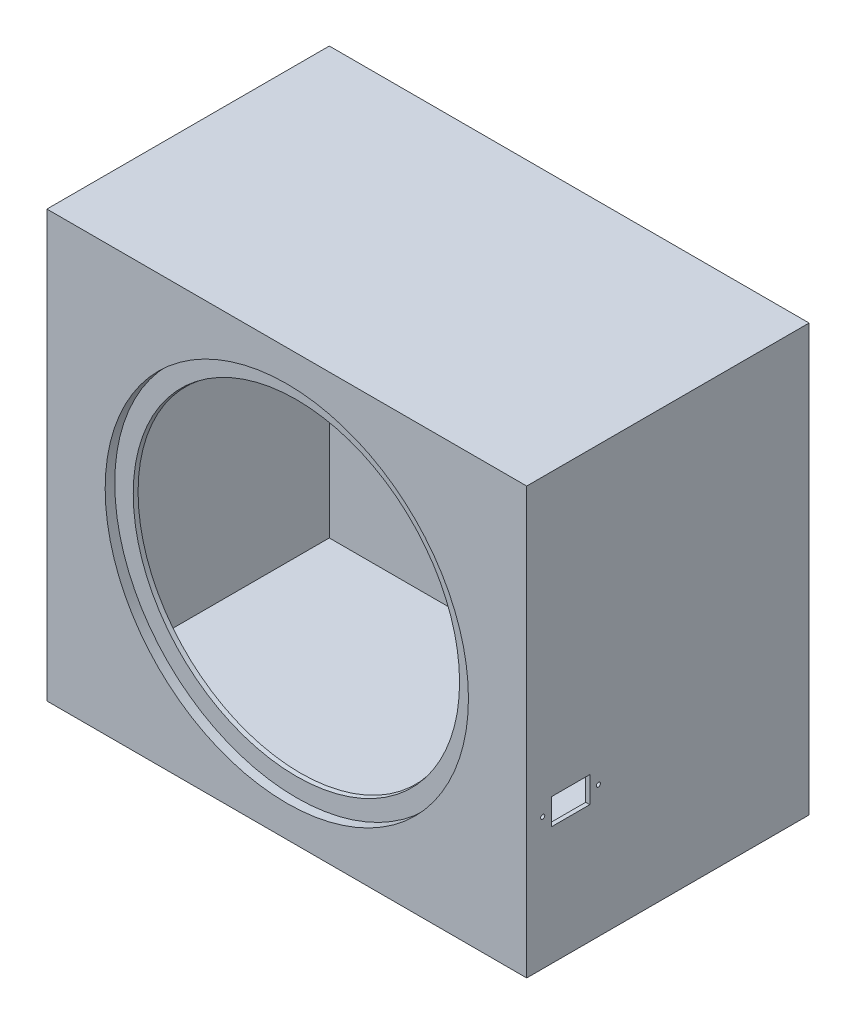
ISO-10303-21;
HEADER;
FILE_DESCRIPTION(('STEP AP214'),'2;1');
FILE_NAME('part.step','',(''),(''),'','','');
FILE_SCHEMA(('AUTOMOTIVE_DESIGN { 1 0 10303 214 1 1 1 1 }'));
ENDSEC;
DATA;
#1=APPLICATION_CONTEXT('core data for automotive mechanical design processes');
#2=APPLICATION_PROTOCOL_DEFINITION('international standard','automotive_design',2000,#1);
#3=PRODUCT_CONTEXT('',#1,'mechanical');
#4=PRODUCT('Part','Part','',(#3));
#5=PRODUCT_RELATED_PRODUCT_CATEGORY('part','',(#4));
#6=PRODUCT_DEFINITION_FORMATION('','',#4);
#7=PRODUCT_DEFINITION_CONTEXT('part definition',#1,'design');
#8=PRODUCT_DEFINITION('design','',#6,#7);
#9=PRODUCT_DEFINITION_SHAPE('','',#8);
#10=(LENGTH_UNIT() NAMED_UNIT(*) SI_UNIT(.MILLI.,.METRE.));
#11=(NAMED_UNIT(*) PLANE_ANGLE_UNIT() SI_UNIT($,.RADIAN.));
#12=(NAMED_UNIT(*) SI_UNIT($,.STERADIAN.) SOLID_ANGLE_UNIT());
#13=UNCERTAINTY_MEASURE_WITH_UNIT(LENGTH_MEASURE(1.E-05),#10,'distance_accuracy_value','');
#14=(GEOMETRIC_REPRESENTATION_CONTEXT(3) GLOBAL_UNCERTAINTY_ASSIGNED_CONTEXT((#13)) GLOBAL_UNIT_ASSIGNED_CONTEXT((#10,
#11,#12)) REPRESENTATION_CONTEXT('',''));
#15=CARTESIAN_POINT('',(0.,0.,0.));
#16=DIRECTION('',(0.,0.,1.));
#17=DIRECTION('',(1.,0.,0.));
#18=AXIS2_PLACEMENT_3D('',#15,#16,#17);
#19=CARTESIAN_POINT('',(0.,0.,-7.00000000000001));
#20=DIRECTION('',(0.,0.,1.));
#21=DIRECTION('',(1.,0.,0.));
#22=AXIS2_PLACEMENT_3D('',#19,#20,#21);
#23=CONICAL_SURFACE('',#22,118.5,0.17453292519943);
#24=CARTESIAN_POINT('',(0.,0.,-4.00000000000001));
#25=DIRECTION('',(0.,0.,-1.));
#26=DIRECTION('',(-1.,0.,0.));
#27=AXIS2_PLACEMENT_3D('',#24,#25,#26);
#28=CIRCLE('',#27,119.028980942125);
#29=CARTESIAN_POINT('',(-119.028980942125,0.,-4.00000000000001));
#30=VERTEX_POINT('',#29);
#31=EDGE_CURVE('E38',#30,#30,#28,.F.);
#32=ORIENTED_EDGE('',*,*,#31,.T.);
#33=EDGE_LOOP('',(#32));
#34=FACE_BOUND('',#33,.T.);
#35=CARTESIAN_POINT('',(0.,0.,-7.00000000000001));
#36=DIRECTION('',(0.,0.,1.));
#37=DIRECTION('',(1.,0.,0.));
#38=AXIS2_PLACEMENT_3D('',#35,#36,#37);
#39=CIRCLE('',#38,118.5);
#40=CARTESIAN_POINT('',(118.5,0.,-7.00000000000001));
#41=VERTEX_POINT('',#40);
#42=EDGE_CURVE('E176',#41,#41,#39,.T.);
#43=ORIENTED_EDGE('',*,*,#42,.F.);
#44=EDGE_LOOP('',(#43));
#45=FACE_BOUND('',#44,.T.);
#46=ADVANCED_FACE('F34',(#34,#45),#23,.F.);
#47=CARTESIAN_POINT('',(-175.,152.4,-200.));
#48=DIRECTION('',(-1.,0.,0.));
#49=DIRECTION('',(0.,0.,1.));
#50=AXIS2_PLACEMENT_3D('',#47,#48,#49);
#51=PLANE('',#50);
#52=CARTESIAN_POINT('',(-175.,-140.4,-40.65));
#53=DIRECTION('',(-1.,0.,0.));
#54=DIRECTION('',(0.,0.,1.));
#55=AXIS2_PLACEMENT_3D('',#52,#53,#54);
#56=CIRCLE('',#55,2.65000000000002);
#57=CARTESIAN_POINT('',(-175.,-140.4,-38.));
#58=VERTEX_POINT('',#57);
#59=EDGE_CURVE('E152',#58,#58,#56,.T.);
#60=ORIENTED_EDGE('',*,*,#59,.F.);
#61=EDGE_LOOP('',(#60));
#62=FACE_BOUND('',#61,.T.);
#63=CARTESIAN_POINT('',(-175.,-140.4,-22.));
#64=DIRECTION('',(-1.,0.,0.));
#65=DIRECTION('',(0.,0.,1.));
#66=AXIS2_PLACEMENT_3D('',#63,#64,#65);
#67=CIRCLE('',#66,2.65000000000002);
#68=CARTESIAN_POINT('',(-175.,-140.4,-19.35));
#69=VERTEX_POINT('',#68);
#70=EDGE_CURVE('E161',#69,#69,#67,.T.);
#71=ORIENTED_EDGE('',*,*,#70,.F.);
#72=EDGE_LOOP('',(#71));
#73=FACE_BOUND('',#72,.T.);
#74=CARTESIAN_POINT('',(-175.,-121.75,-22.));
#75=DIRECTION('',(-1.,0.,0.));
#76=DIRECTION('',(0.,0.,1.));
#77=AXIS2_PLACEMENT_3D('',#74,#75,#76);
#78=CIRCLE('',#77,2.65000000000001);
#79=CARTESIAN_POINT('',(-175.,-121.75,-19.35));
#80=VERTEX_POINT('',#79);
#81=EDGE_CURVE('E153',#80,#80,#78,.T.);
#82=ORIENTED_EDGE('',*,*,#81,.F.);
#83=EDGE_LOOP('',(#82));
#84=FACE_BOUND('',#83,.T.);
#85=CARTESIAN_POINT('',(-175.,-121.75,-40.65));
#86=DIRECTION('',(-1.,0.,0.));
#87=DIRECTION('',(0.,0.,1.));
#88=AXIS2_PLACEMENT_3D('',#85,#86,#87);
#89=CIRCLE('',#88,2.65000000000001);
#90=CARTESIAN_POINT('',(-175.,-121.75,-38.));
#91=VERTEX_POINT('',#90);
#92=EDGE_CURVE('E160',#91,#91,#89,.T.);
#93=ORIENTED_EDGE('',*,*,#92,.F.);
#94=EDGE_LOOP('',(#93));
#95=FACE_BOUND('',#94,.T.);
#96=DIRECTION('',(0.,0.,-1.));
#97=VECTOR('',#96,1.);
#98=CARTESIAN_POINT('',(-175.,-155.4,-200.));
#99=LINE('',#98,#97);
#100=CARTESIAN_POINT('',(-175.,-155.4,3.));
#101=VERTEX_POINT('',#100);
#102=CARTESIAN_POINT('',(-175.,-155.4,-203.));
#103=VERTEX_POINT('',#102);
#104=EDGE_CURVE('E217',#101,#103,#99,.T.);
#105=ORIENTED_EDGE('',*,*,#104,.F.);
#106=DIRECTION('',(0.,-1.,0.));
#107=VECTOR('',#106,1.);
#108=CARTESIAN_POINT('',(-175.,152.4,3.));
#109=LINE('',#108,#107);
#110=CARTESIAN_POINT('',(-175.,155.4,3.));
#111=VERTEX_POINT('',#110);
#112=EDGE_CURVE('E222',#111,#101,#109,.T.);
#113=ORIENTED_EDGE('',*,*,#112,.F.);
#114=DIRECTION('',(0.,0.,-1.));
#115=VECTOR('',#114,1.);
#116=CARTESIAN_POINT('',(-175.,155.4,-200.));
#117=LINE('',#116,#115);
#118=CARTESIAN_POINT('',(-175.,155.4,-203.));
#119=VERTEX_POINT('',#118);
#120=EDGE_CURVE('E227',#111,#119,#117,.T.);
#121=ORIENTED_EDGE('',*,*,#120,.T.);
#122=DIRECTION('',(0.,-1.,0.));
#123=VECTOR('',#122,1.);
#124=CARTESIAN_POINT('',(-175.,152.4,-203.));
#125=LINE('',#124,#123);
#126=EDGE_CURVE('E225',#119,#103,#125,.T.);
#127=ORIENTED_EDGE('',*,*,#126,.T.);
#128=EDGE_LOOP('',(#105,#113,#121,#127));
#129=FACE_BOUND('',#128,.T.);
#130=ADVANCED_FACE('F270',(#62,#73,#84,#95,#129),#51,.T.);
#131=CARTESIAN_POINT('',(150.,155.4,-200.));
#132=DIRECTION('',(0.,1.,0.));
#133=DIRECTION('',(0.,0.,1.));
#134=AXIS2_PLACEMENT_3D('',#131,#132,#133);
#135=PLANE('',#134);
#136=DIRECTION('',(-1.,0.,0.));
#137=VECTOR('',#136,1.);
#138=CARTESIAN_POINT('',(150.,155.4,3.));
#139=LINE('',#138,#137);
#140=CARTESIAN_POINT('',(175.,155.4,3.));
#141=VERTEX_POINT('',#140);
#142=EDGE_CURVE('E234',#141,#111,#139,.T.);
#143=ORIENTED_EDGE('',*,*,#142,.F.);
#144=DIRECTION('',(0.,0.,1.));
#145=VECTOR('',#144,1.);
#146=CARTESIAN_POINT('',(175.,155.4,0.));
#147=LINE('',#146,#145);
#148=CARTESIAN_POINT('',(175.,155.4,-203.));
#149=VERTEX_POINT('',#148);
#150=EDGE_CURVE('E220',#149,#141,#147,.T.);
#151=ORIENTED_EDGE('',*,*,#150,.F.);
#152=DIRECTION('',(-1.,0.,0.));
#153=VECTOR('',#152,1.);
#154=CARTESIAN_POINT('',(150.,155.4,-203.));
#155=LINE('',#154,#153);
#156=EDGE_CURVE('E11',#149,#119,#155,.T.);
#157=ORIENTED_EDGE('',*,*,#156,.T.);
#158=ORIENTED_EDGE('',*,*,#120,.F.);
#159=EDGE_LOOP('',(#143,#151,#157,#158));
#160=FACE_BOUND('',#159,.T.);
#161=ADVANCED_FACE('F275',(#160),#135,.T.);
#162=CARTESIAN_POINT('',(150.,-155.4,-200.));
#163=DIRECTION('',(0.,-1.,0.));
#164=DIRECTION('',(0.,0.,-1.));
#165=AXIS2_PLACEMENT_3D('',#162,#163,#164);
#166=PLANE('',#165);
#167=DIRECTION('',(1.,0.,0.));
#168=VECTOR('',#167,1.);
#169=CARTESIAN_POINT('',(150.,-155.4,3.));
#170=LINE('',#169,#168);
#171=CARTESIAN_POINT('',(175.,-155.4,3.));
#172=VERTEX_POINT('',#171);
#173=EDGE_CURVE('E233',#101,#172,#170,.T.);
#174=ORIENTED_EDGE('',*,*,#173,.F.);
#175=ORIENTED_EDGE('',*,*,#104,.T.);
#176=DIRECTION('',(1.,0.,0.));
#177=VECTOR('',#176,1.);
#178=CARTESIAN_POINT('',(150.,-155.4,-203.));
#179=LINE('',#178,#177);
#180=CARTESIAN_POINT('',(175.,-155.4,-203.));
#181=VERTEX_POINT('',#180);
#182=EDGE_CURVE('E43',#103,#181,#179,.T.);
#183=ORIENTED_EDGE('',*,*,#182,.T.);
#184=DIRECTION('',(0.,0.,1.));
#185=VECTOR('',#184,1.);
#186=CARTESIAN_POINT('',(175.,-155.4,-200.));
#187=LINE('',#186,#185);
#188=EDGE_CURVE('E221',#181,#172,#187,.T.);
#189=ORIENTED_EDGE('',*,*,#188,.T.);
#190=EDGE_LOOP('',(#174,#175,#183,#189));
#191=FACE_BOUND('',#190,.T.);
#192=ADVANCED_FACE('F284',(#191),#166,.T.);
#193=CARTESIAN_POINT('',(0.,0.,-203.));
#194=DIRECTION('',(0.,0.,-1.));
#195=DIRECTION('',(-1.,0.,0.));
#196=AXIS2_PLACEMENT_3D('',#193,#194,#195);
#197=PLANE('',#196);
#198=ORIENTED_EDGE('',*,*,#182,.F.);
#199=ORIENTED_EDGE('',*,*,#126,.F.);
#200=ORIENTED_EDGE('',*,*,#156,.F.);
#201=DIRECTION('',(0.,-1.,0.));
#202=VECTOR('',#201,1.);
#203=CARTESIAN_POINT('',(175.,0.,-203.));
#204=LINE('',#203,#202);
#205=EDGE_CURVE('E230',#149,#181,#204,.T.);
#206=ORIENTED_EDGE('',*,*,#205,.T.);
#207=EDGE_LOOP('',(#198,#199,#200,#206));
#208=FACE_BOUND('',#207,.T.);
#209=ADVANCED_FACE('F288',(#208),#197,.T.);
#210=CARTESIAN_POINT('',(0.,0.,3.));
#211=DIRECTION('',(0.,0.,-1.));
#212=DIRECTION('',(-1.,0.,0.));
#213=AXIS2_PLACEMENT_3D('',#210,#211,#212);
#214=PLANE('',#213);
#215=CARTESIAN_POINT('',(0.,0.,3.));
#216=DIRECTION('',(0.,0.,-1.));
#217=DIRECTION('',(-1.,0.,0.));
#218=AXIS2_PLACEMENT_3D('',#215,#216,#217);
#219=CIRCLE('',#218,132.5);
#220=CARTESIAN_POINT('',(-132.5,0.,3.));
#221=VERTEX_POINT('',#220);
#222=EDGE_CURVE('E244',#221,#221,#219,.F.);
#223=ORIENTED_EDGE('',*,*,#222,.F.);
#224=EDGE_LOOP('',(#223));
#225=FACE_BOUND('',#224,.T.);
#226=ORIENTED_EDGE('',*,*,#142,.T.);
#227=ORIENTED_EDGE('',*,*,#112,.T.);
#228=ORIENTED_EDGE('',*,*,#173,.T.);
#229=DIRECTION('',(0.,-1.,0.));
#230=VECTOR('',#229,1.);
#231=CARTESIAN_POINT('',(175.,0.,3.));
#232=LINE('',#231,#230);
#233=EDGE_CURVE('E226',#141,#172,#232,.T.);
#234=ORIENTED_EDGE('',*,*,#233,.F.);
#235=EDGE_LOOP('',(#226,#227,#228,#234));
#236=FACE_BOUND('',#235,.T.);
#237=ADVANCED_FACE('F292',(#225,#236),#214,.F.);
#238=CARTESIAN_POINT('',(175.,152.4,0.));
#239=DIRECTION('',(1.,0.,0.));
#240=DIRECTION('',(0.,0.,-1.));
#241=AXIS2_PLACEMENT_3D('',#238,#239,#240);
#242=PLANE('',#241);
#243=CARTESIAN_POINT('',(175.,-59.4,-49.32));
#244=DIRECTION('',(1.,0.,0.));
#245=DIRECTION('',(0.,0.,-1.));
#246=AXIS2_PLACEMENT_3D('',#243,#244,#245);
#247=CIRCLE('',#246,1.5);
#248=CARTESIAN_POINT('',(175.,-59.4,-50.82));
#249=VERTEX_POINT('',#248);
#250=EDGE_CURVE('E306',#249,#249,#247,.T.);
#251=ORIENTED_EDGE('',*,*,#250,.F.);
#252=EDGE_LOOP('',(#251));
#253=FACE_BOUND('',#252,.T.);
#254=CARTESIAN_POINT('',(175.,-59.4,-8.68));
#255=DIRECTION('',(1.,0.,0.));
#256=DIRECTION('',(0.,0.,-1.));
#257=AXIS2_PLACEMENT_3D('',#254,#255,#256);
#258=CIRCLE('',#257,1.5);
#259=CARTESIAN_POINT('',(175.,-59.4,-10.18));
#260=VERTEX_POINT('',#259);
#261=EDGE_CURVE('E310',#260,#260,#258,.T.);
#262=ORIENTED_EDGE('',*,*,#261,.F.);
#263=EDGE_LOOP('',(#262));
#264=FACE_BOUND('',#263,.T.);
#265=DIRECTION('',(0.,0.,-1.));
#266=VECTOR('',#265,1.);
#267=CARTESIAN_POINT('',(175.,-68.9,-15.));
#268=LINE('',#267,#266);
#269=CARTESIAN_POINT('',(175.,-68.9,-15.));
#270=VERTEX_POINT('',#269);
#271=CARTESIAN_POINT('',(175.,-68.9,-43.));
#272=VERTEX_POINT('',#271);
#273=EDGE_CURVE('E315',#270,#272,#268,.T.);
#274=ORIENTED_EDGE('',*,*,#273,.F.);
#275=DIRECTION('',(0.,-1.,0.));
#276=VECTOR('',#275,1.);
#277=CARTESIAN_POINT('',(175.,-49.9,-15.));
#278=LINE('',#277,#276);
#279=CARTESIAN_POINT('',(175.,-49.9,-15.));
#280=VERTEX_POINT('',#279);
#281=EDGE_CURVE('E144',#280,#270,#278,.T.);
#282=ORIENTED_EDGE('',*,*,#281,.F.);
#283=DIRECTION('',(0.,0.,1.));
#284=VECTOR('',#283,1.);
#285=CARTESIAN_POINT('',(175.,-49.9,-15.));
#286=LINE('',#285,#284);
#287=CARTESIAN_POINT('',(175.,-49.9,-43.));
#288=VERTEX_POINT('',#287);
#289=EDGE_CURVE('E51',#288,#280,#286,.T.);
#290=ORIENTED_EDGE('',*,*,#289,.F.);
#291=DIRECTION('',(0.,1.,0.));
#292=VECTOR('',#291,1.);
#293=CARTESIAN_POINT('',(175.,-49.9,-43.));
#294=LINE('',#293,#292);
#295=EDGE_CURVE('E327',#272,#288,#294,.T.);
#296=ORIENTED_EDGE('',*,*,#295,.F.);
#297=EDGE_LOOP('',(#274,#282,#290,#296));
#298=FACE_BOUND('',#297,.T.);
#299=ORIENTED_EDGE('',*,*,#188,.F.);
#300=ORIENTED_EDGE('',*,*,#205,.F.);
#301=ORIENTED_EDGE('',*,*,#150,.T.);
#302=ORIENTED_EDGE('',*,*,#233,.T.);
#303=EDGE_LOOP('',(#299,#300,#301,#302));
#304=FACE_BOUND('',#303,.T.);
#305=ADVANCED_FACE('F267',(#253,#264,#298,#304),#242,.T.);
#306=CARTESIAN_POINT('',(0.,0.,0.));
#307=DIRECTION('',(0.,0.,1.));
#308=DIRECTION('',(1.,0.,0.));
#309=AXIS2_PLACEMENT_3D('',#306,#307,#308);
#310=CYLINDRICAL_SURFACE('',#309,132.5);
#311=CARTESIAN_POINT('',(0.,0.,-4.00000000000001));
#312=DIRECTION('',(0.,0.,-1.));
#313=DIRECTION('',(-1.,0.,0.));
#314=AXIS2_PLACEMENT_3D('',#311,#312,#313);
#315=CIRCLE('',#314,132.5);
#316=CARTESIAN_POINT('',(-132.5,0.,-4.00000000000001));
#317=VERTEX_POINT('',#316);
#318=EDGE_CURVE('E247',#317,#317,#315,.F.);
#319=ORIENTED_EDGE('',*,*,#318,.F.);
#320=EDGE_LOOP('',(#319));
#321=FACE_BOUND('',#320,.T.);
#322=ORIENTED_EDGE('',*,*,#222,.T.);
#323=EDGE_LOOP('',(#322));
#324=FACE_BOUND('',#323,.T.);
#325=ADVANCED_FACE('F259',(#321,#324),#310,.F.);
#326=CARTESIAN_POINT('',(135.5,0.,-4.00000000000001));
#327=DIRECTION('',(0.,0.,-1.));
#328=DIRECTION('',(-1.,0.,0.));
#329=AXIS2_PLACEMENT_3D('',#326,#327,#328);
#330=PLANE('',#329);
#331=ORIENTED_EDGE('',*,*,#31,.F.);
#332=EDGE_LOOP('',(#331));
#333=FACE_BOUND('',#332,.T.);
#334=ORIENTED_EDGE('',*,*,#318,.T.);
#335=EDGE_LOOP('',(#334));
#336=FACE_BOUND('',#335,.T.);
#337=ADVANCED_FACE('F36',(#333,#336),#330,.F.);
#338=CARTESIAN_POINT('',(-172.,152.4,-200.));
#339=DIRECTION('',(-1.,0.,0.));
#340=DIRECTION('',(0.,0.,1.));
#341=AXIS2_PLACEMENT_3D('',#338,#339,#340);
#342=PLANE('',#341);
#343=CARTESIAN_POINT('',(-172.,-140.4,-40.65));
#344=DIRECTION('',(-1.,0.,0.));
#345=DIRECTION('',(0.,0.,1.));
#346=AXIS2_PLACEMENT_3D('',#343,#344,#345);
#347=CIRCLE('',#346,2.65000000000002);
#348=CARTESIAN_POINT('',(-172.,-140.4,-38.));
#349=VERTEX_POINT('',#348);
#350=EDGE_CURVE('E164',#349,#349,#347,.F.);
#351=ORIENTED_EDGE('',*,*,#350,.F.);
#352=EDGE_LOOP('',(#351));
#353=FACE_BOUND('',#352,.T.);
#354=CARTESIAN_POINT('',(-172.,-140.4,-22.));
#355=DIRECTION('',(-1.,0.,0.));
#356=DIRECTION('',(0.,0.,1.));
#357=AXIS2_PLACEMENT_3D('',#354,#355,#356);
#358=CIRCLE('',#357,2.65000000000002);
#359=CARTESIAN_POINT('',(-172.,-140.4,-19.35));
#360=VERTEX_POINT('',#359);
#361=EDGE_CURVE('E157',#360,#360,#358,.F.);
#362=ORIENTED_EDGE('',*,*,#361,.F.);
#363=EDGE_LOOP('',(#362));
#364=FACE_BOUND('',#363,.T.);
#365=CARTESIAN_POINT('',(-172.,-121.75,-22.));
#366=DIRECTION('',(-1.,0.,0.));
#367=DIRECTION('',(0.,0.,1.));
#368=AXIS2_PLACEMENT_3D('',#365,#366,#367);
#369=CIRCLE('',#368,2.65000000000001);
#370=CARTESIAN_POINT('',(-172.,-121.75,-19.35));
#371=VERTEX_POINT('',#370);
#372=EDGE_CURVE('E156',#371,#371,#369,.F.);
#373=ORIENTED_EDGE('',*,*,#372,.F.);
#374=EDGE_LOOP('',(#373));
#375=FACE_BOUND('',#374,.T.);
#376=CARTESIAN_POINT('',(-172.,-121.75,-40.65));
#377=DIRECTION('',(-1.,0.,0.));
#378=DIRECTION('',(0.,0.,1.));
#379=AXIS2_PLACEMENT_3D('',#376,#377,#378);
#380=CIRCLE('',#379,2.65000000000001);
#381=CARTESIAN_POINT('',(-172.,-121.75,-38.));
#382=VERTEX_POINT('',#381);
#383=EDGE_CURVE('E173',#382,#382,#380,.F.);
#384=ORIENTED_EDGE('',*,*,#383,.F.);
#385=EDGE_LOOP('',(#384));
#386=FACE_BOUND('',#385,.T.);
#387=DIRECTION('',(0.,0.,-1.));
#388=VECTOR('',#387,1.);
#389=CARTESIAN_POINT('',(-172.,-152.4,-200.));
#390=LINE('',#389,#388);
#391=CARTESIAN_POINT('',(-172.,-152.4,0.));
#392=VERTEX_POINT('',#391);
#393=CARTESIAN_POINT('',(-172.,-152.4,-200.));
#394=VERTEX_POINT('',#393);
#395=EDGE_CURVE('E190',#392,#394,#390,.T.);
#396=ORIENTED_EDGE('',*,*,#395,.T.);
#397=DIRECTION('',(0.,-1.,0.));
#398=VECTOR('',#397,1.);
#399=CARTESIAN_POINT('',(-172.,152.4,-200.));
#400=LINE('',#399,#398);
#401=CARTESIAN_POINT('',(-172.,152.4,-200.));
#402=VERTEX_POINT('',#401);
#403=EDGE_CURVE('E198',#402,#394,#400,.T.);
#404=ORIENTED_EDGE('',*,*,#403,.F.);
#405=DIRECTION('',(0.,0.,-1.));
#406=VECTOR('',#405,1.);
#407=CARTESIAN_POINT('',(-172.,152.4,-127.5));
#408=LINE('',#407,#406);
#409=CARTESIAN_POINT('',(-172.,152.4,0.));
#410=VERTEX_POINT('',#409);
#411=EDGE_CURVE('E189',#410,#402,#408,.T.);
#412=ORIENTED_EDGE('',*,*,#411,.F.);
#413=DIRECTION('',(0.,-1.,0.));
#414=VECTOR('',#413,1.);
#415=CARTESIAN_POINT('',(-172.,152.4,0.));
#416=LINE('',#415,#414);
#417=EDGE_CURVE('E202',#410,#392,#416,.T.);
#418=ORIENTED_EDGE('',*,*,#417,.T.);
#419=EDGE_LOOP('',(#396,#404,#412,#418));
#420=FACE_BOUND('',#419,.T.);
#421=ADVANCED_FACE('F258',(#353,#364,#375,#386,#420),#342,.F.);
#422=CARTESIAN_POINT('',(150.,152.4,-200.));
#423=DIRECTION('',(0.,1.,0.));
#424=DIRECTION('',(0.,0.,1.));
#425=AXIS2_PLACEMENT_3D('',#422,#423,#424);
#426=PLANE('',#425);
#427=DIRECTION('',(-1.,0.,0.));
#428=VECTOR('',#427,1.);
#429=CARTESIAN_POINT('',(150.,152.4,0.));
#430=LINE('',#429,#428);
#431=CARTESIAN_POINT('',(172.,152.4,0.));
#432=VERTEX_POINT('',#431);
#433=EDGE_CURVE('E213',#432,#410,#430,.T.);
#434=ORIENTED_EDGE('',*,*,#433,.T.);
#435=ORIENTED_EDGE('',*,*,#411,.T.);
#436=DIRECTION('',(-1.,0.,0.));
#437=VECTOR('',#436,1.);
#438=CARTESIAN_POINT('',(150.,152.4,-200.));
#439=LINE('',#438,#437);
#440=CARTESIAN_POINT('',(172.,152.4,-200.));
#441=VERTEX_POINT('',#440);
#442=EDGE_CURVE('E212',#441,#402,#439,.T.);
#443=ORIENTED_EDGE('',*,*,#442,.F.);
#444=DIRECTION('',(0.,0.,1.));
#445=VECTOR('',#444,1.);
#446=CARTESIAN_POINT('',(172.,152.4,-127.5));
#447=LINE('',#446,#445);
#448=EDGE_CURVE('E186',#441,#432,#447,.T.);
#449=ORIENTED_EDGE('',*,*,#448,.T.);
#450=EDGE_LOOP('',(#434,#435,#443,#449));
#451=FACE_BOUND('',#450,.T.);
#452=ADVANCED_FACE('F264',(#451),#426,.F.);
#453=CARTESIAN_POINT('',(150.,-152.4,-200.));
#454=DIRECTION('',(0.,-1.,0.));
#455=DIRECTION('',(0.,0.,-1.));
#456=AXIS2_PLACEMENT_3D('',#453,#454,#455);
#457=PLANE('',#456);
#458=DIRECTION('',(1.,0.,0.));
#459=VECTOR('',#458,1.);
#460=CARTESIAN_POINT('',(150.,-152.4,0.));
#461=LINE('',#460,#459);
#462=CARTESIAN_POINT('',(172.,-152.4,0.));
#463=VERTEX_POINT('',#462);
#464=EDGE_CURVE('E201',#392,#463,#461,.T.);
#465=ORIENTED_EDGE('',*,*,#464,.T.);
#466=DIRECTION('',(0.,0.,1.));
#467=VECTOR('',#466,1.);
#468=CARTESIAN_POINT('',(172.,-152.4,0.));
#469=LINE('',#468,#467);
#470=CARTESIAN_POINT('',(172.,-152.4,-200.));
#471=VERTEX_POINT('',#470);
#472=EDGE_CURVE('E185',#471,#463,#469,.T.);
#473=ORIENTED_EDGE('',*,*,#472,.F.);
#474=DIRECTION('',(1.,0.,0.));
#475=VECTOR('',#474,1.);
#476=CARTESIAN_POINT('',(150.,-152.4,-200.));
#477=LINE('',#476,#475);
#478=EDGE_CURVE('E210',#394,#471,#477,.T.);
#479=ORIENTED_EDGE('',*,*,#478,.F.);
#480=ORIENTED_EDGE('',*,*,#395,.F.);
#481=EDGE_LOOP('',(#465,#473,#479,#480));
#482=FACE_BOUND('',#481,.T.);
#483=ADVANCED_FACE('F279',(#482),#457,.F.);
#484=CARTESIAN_POINT('',(0.,0.,-200.));
#485=DIRECTION('',(0.,0.,-1.));
#486=DIRECTION('',(-1.,0.,0.));
#487=AXIS2_PLACEMENT_3D('',#484,#485,#486);
#488=PLANE('',#487);
#489=ORIENTED_EDGE('',*,*,#478,.T.);
#490=DIRECTION('',(0.,-1.,0.));
#491=VECTOR('',#490,1.);
#492=CARTESIAN_POINT('',(172.,152.4,-200.));
#493=LINE('',#492,#491);
#494=EDGE_CURVE('E193',#441,#471,#493,.T.);
#495=ORIENTED_EDGE('',*,*,#494,.F.);
#496=ORIENTED_EDGE('',*,*,#442,.T.);
#497=ORIENTED_EDGE('',*,*,#403,.T.);
#498=EDGE_LOOP('',(#489,#495,#496,#497));
#499=FACE_BOUND('',#498,.T.);
#500=ADVANCED_FACE('F356',(#499),#488,.F.);
#501=CARTESIAN_POINT('',(0.,0.,0.));
#502=DIRECTION('',(0.,0.,-1.));
#503=DIRECTION('',(-1.,0.,0.));
#504=AXIS2_PLACEMENT_3D('',#501,#502,#503);
#505=PLANE('',#504);
#506=CARTESIAN_POINT('',(0.,0.,0.));
#507=DIRECTION('',(0.,0.,1.));
#508=DIRECTION('',(1.,0.,0.));
#509=AXIS2_PLACEMENT_3D('',#506,#507,#508);
#510=CIRCLE('',#509,135.5);
#511=CARTESIAN_POINT('',(135.5,0.,0.));
#512=VERTEX_POINT('',#511);
#513=EDGE_CURVE('E182',#512,#512,#510,.T.);
#514=ORIENTED_EDGE('',*,*,#513,.T.);
#515=EDGE_LOOP('',(#514));
#516=FACE_BOUND('',#515,.T.);
#517=ORIENTED_EDGE('',*,*,#433,.F.);
#518=DIRECTION('',(0.,-1.,0.));
#519=VECTOR('',#518,1.);
#520=CARTESIAN_POINT('',(172.,152.4,0.));
#521=LINE('',#520,#519);
#522=EDGE_CURVE('E205',#432,#463,#521,.T.);
#523=ORIENTED_EDGE('',*,*,#522,.T.);
#524=ORIENTED_EDGE('',*,*,#464,.F.);
#525=ORIENTED_EDGE('',*,*,#417,.F.);
#526=EDGE_LOOP('',(#517,#523,#524,#525));
#527=FACE_BOUND('',#526,.T.);
#528=ADVANCED_FACE('F345',(#516,#527),#505,.T.);
#529=CARTESIAN_POINT('',(172.,152.4,0.));
#530=DIRECTION('',(1.,0.,0.));
#531=DIRECTION('',(0.,0.,-1.));
#532=AXIS2_PLACEMENT_3D('',#529,#530,#531);
#533=PLANE('',#532);
#534=CARTESIAN_POINT('',(172.,-59.4,-49.32));
#535=DIRECTION('',(1.,0.,0.));
#536=DIRECTION('',(0.,0.,-1.));
#537=AXIS2_PLACEMENT_3D('',#534,#535,#536);
#538=CIRCLE('',#537,1.5);
#539=CARTESIAN_POINT('',(172.,-59.4,-50.82));
#540=VERTEX_POINT('',#539);
#541=EDGE_CURVE('E335',#540,#540,#538,.F.);
#542=ORIENTED_EDGE('',*,*,#541,.F.);
#543=EDGE_LOOP('',(#542));
#544=FACE_BOUND('',#543,.T.);
#545=CARTESIAN_POINT('',(172.,-59.4,-8.68));
#546=DIRECTION('',(1.,0.,0.));
#547=DIRECTION('',(0.,0.,-1.));
#548=AXIS2_PLACEMENT_3D('',#545,#546,#547);
#549=CIRCLE('',#548,1.5);
#550=CARTESIAN_POINT('',(172.,-59.4,-10.18));
#551=VERTEX_POINT('',#550);
#552=EDGE_CURVE('E334',#551,#551,#549,.F.);
#553=ORIENTED_EDGE('',*,*,#552,.F.);
#554=EDGE_LOOP('',(#553));
#555=FACE_BOUND('',#554,.T.);
#556=DIRECTION('',(0.,1.,0.));
#557=VECTOR('',#556,1.);
#558=CARTESIAN_POINT('',(172.,-49.9,-15.));
#559=LINE('',#558,#557);
#560=CARTESIAN_POINT('',(172.,-68.9,-15.));
#561=VERTEX_POINT('',#560);
#562=CARTESIAN_POINT('',(172.,-49.9,-15.));
#563=VERTEX_POINT('',#562);
#564=EDGE_CURVE('E135',#561,#563,#559,.T.);
#565=ORIENTED_EDGE('',*,*,#564,.F.);
#566=DIRECTION('',(0.,0.,1.));
#567=VECTOR('',#566,1.);
#568=CARTESIAN_POINT('',(172.,-68.9,-15.));
#569=LINE('',#568,#567);
#570=CARTESIAN_POINT('',(172.,-68.9,-43.));
#571=VERTEX_POINT('',#570);
#572=EDGE_CURVE('E59',#571,#561,#569,.T.);
#573=ORIENTED_EDGE('',*,*,#572,.F.);
#574=DIRECTION('',(0.,-1.,0.));
#575=VECTOR('',#574,1.);
#576=CARTESIAN_POINT('',(172.,-49.9,-43.));
#577=LINE('',#576,#575);
#578=CARTESIAN_POINT('',(172.,-49.9,-43.));
#579=VERTEX_POINT('',#578);
#580=EDGE_CURVE('E142',#579,#571,#577,.T.);
#581=ORIENTED_EDGE('',*,*,#580,.F.);
#582=DIRECTION('',(0.,0.,-1.));
#583=VECTOR('',#582,1.);
#584=CARTESIAN_POINT('',(172.,-49.9,-15.));
#585=LINE('',#584,#583);
#586=EDGE_CURVE('E126',#563,#579,#585,.T.);
#587=ORIENTED_EDGE('',*,*,#586,.F.);
#588=EDGE_LOOP('',(#565,#573,#581,#587));
#589=FACE_BOUND('',#588,.T.);
#590=ORIENTED_EDGE('',*,*,#472,.T.);
#591=ORIENTED_EDGE('',*,*,#522,.F.);
#592=ORIENTED_EDGE('',*,*,#448,.F.);
#593=ORIENTED_EDGE('',*,*,#494,.T.);
#594=EDGE_LOOP('',(#590,#591,#592,#593));
#595=FACE_BOUND('',#594,.T.);
#596=ADVANCED_FACE('F139',(#544,#555,#589,#595),#533,.F.);
#597=CARTESIAN_POINT('',(0.,0.,0.));
#598=DIRECTION('',(0.,0.,1.));
#599=DIRECTION('',(1.,0.,0.));
#600=AXIS2_PLACEMENT_3D('',#597,#598,#599);
#601=CYLINDRICAL_SURFACE('',#600,135.5);
#602=CARTESIAN_POINT('',(0.,0.,-7.00000000000001));
#603=DIRECTION('',(0.,0.,1.));
#604=DIRECTION('',(1.,0.,0.));
#605=AXIS2_PLACEMENT_3D('',#602,#603,#604);
#606=CIRCLE('',#605,135.5);
#607=CARTESIAN_POINT('',(135.5,0.,-7.00000000000001));
#608=VERTEX_POINT('',#607);
#609=EDGE_CURVE('E179',#608,#608,#606,.T.);
#610=ORIENTED_EDGE('',*,*,#609,.T.);
#611=EDGE_LOOP('',(#610));
#612=FACE_BOUND('',#611,.T.);
#613=ORIENTED_EDGE('',*,*,#513,.F.);
#614=EDGE_LOOP('',(#613));
#615=FACE_BOUND('',#614,.T.);
#616=ADVANCED_FACE('F344',(#612,#615),#601,.T.);
#617=CARTESIAN_POINT('',(135.5,0.,-7.00000000000001));
#618=DIRECTION('',(0.,0.,-1.));
#619=DIRECTION('',(-1.,0.,0.));
#620=AXIS2_PLACEMENT_3D('',#617,#618,#619);
#621=PLANE('',#620);
#622=ORIENTED_EDGE('',*,*,#42,.T.);
#623=EDGE_LOOP('',(#622));
#624=FACE_BOUND('',#623,.T.);
#625=ORIENTED_EDGE('',*,*,#609,.F.);
#626=EDGE_LOOP('',(#625));
#627=FACE_BOUND('',#626,.T.);
#628=ADVANCED_FACE('F352',(#624,#627),#621,.T.);
#629=CARTESIAN_POINT('',(175.001,-121.75,-40.6499999999999));
#630=DIRECTION('',(-1.,0.,0.));
#631=DIRECTION('',(0.,0.,1.));
#632=AXIS2_PLACEMENT_3D('',#629,#630,#631);
#633=CYLINDRICAL_SURFACE('',#632,2.65000000000001);
#634=ORIENTED_EDGE('',*,*,#92,.T.);
#635=EDGE_LOOP('',(#634));
#636=FACE_BOUND('',#635,.T.);
#637=ORIENTED_EDGE('',*,*,#383,.T.);
#638=EDGE_LOOP('',(#637));
#639=FACE_BOUND('',#638,.T.);
#640=ADVANCED_FACE('F405',(#636,#639),#633,.F.);
#641=CARTESIAN_POINT('',(175.001,-121.75,-21.9999999999999));
#642=DIRECTION('',(-1.,0.,0.));
#643=DIRECTION('',(0.,0.,1.));
#644=AXIS2_PLACEMENT_3D('',#641,#642,#643);
#645=CYLINDRICAL_SURFACE('',#644,2.65000000000001);
#646=ORIENTED_EDGE('',*,*,#81,.T.);
#647=EDGE_LOOP('',(#646));
#648=FACE_BOUND('',#647,.T.);
#649=ORIENTED_EDGE('',*,*,#372,.T.);
#650=EDGE_LOOP('',(#649));
#651=FACE_BOUND('',#650,.T.);
#652=ADVANCED_FACE('F414',(#648,#651),#645,.F.);
#653=CARTESIAN_POINT('',(175.001,-140.4,-21.9999999999999));
#654=DIRECTION('',(-1.,0.,0.));
#655=DIRECTION('',(0.,0.,1.));
#656=AXIS2_PLACEMENT_3D('',#653,#654,#655);
#657=CYLINDRICAL_SURFACE('',#656,2.65000000000002);
#658=ORIENTED_EDGE('',*,*,#70,.T.);
#659=EDGE_LOOP('',(#658));
#660=FACE_BOUND('',#659,.T.);
#661=ORIENTED_EDGE('',*,*,#361,.T.);
#662=EDGE_LOOP('',(#661));
#663=FACE_BOUND('',#662,.T.);
#664=ADVANCED_FACE('F423',(#660,#663),#657,.F.);
#665=CARTESIAN_POINT('',(175.001,-140.4,-40.6499999999999));
#666=DIRECTION('',(-1.,0.,0.));
#667=DIRECTION('',(0.,0.,1.));
#668=AXIS2_PLACEMENT_3D('',#665,#666,#667);
#669=CYLINDRICAL_SURFACE('',#668,2.65000000000002);
#670=ORIENTED_EDGE('',*,*,#59,.T.);
#671=EDGE_LOOP('',(#670));
#672=FACE_BOUND('',#671,.T.);
#673=ORIENTED_EDGE('',*,*,#350,.T.);
#674=EDGE_LOOP('',(#673));
#675=FACE_BOUND('',#674,.T.);
#676=ADVANCED_FACE('F431',(#672,#675),#669,.F.);
#677=CARTESIAN_POINT('',(-175.001,-68.9,-15.));
#678=DIRECTION('',(0.,-1.,0.));
#679=DIRECTION('',(0.,0.,-1.));
#680=AXIS2_PLACEMENT_3D('',#677,#678,#679);
#681=PLANE('',#680);
#682=ORIENTED_EDGE('',*,*,#572,.T.);
#683=DIRECTION('',(1.,0.,0.));
#684=VECTOR('',#683,1.);
#685=CARTESIAN_POINT('',(-175.001,-68.9,-15.));
#686=LINE('',#685,#684);
#687=EDGE_CURVE('E131',#561,#270,#686,.T.);
#688=ORIENTED_EDGE('',*,*,#687,.T.);
#689=ORIENTED_EDGE('',*,*,#273,.T.);
#690=DIRECTION('',(1.,0.,0.));
#691=VECTOR('',#690,1.);
#692=CARTESIAN_POINT('',(-175.001,-68.9,-43.));
#693=LINE('',#692,#691);
#694=EDGE_CURVE('E149',#571,#272,#693,.T.);
#695=ORIENTED_EDGE('',*,*,#694,.F.);
#696=EDGE_LOOP('',(#682,#688,#689,#695));
#697=FACE_BOUND('',#696,.T.);
#698=ADVANCED_FACE('F438',(#697),#681,.F.);
#699=CARTESIAN_POINT('',(-175.001,-49.9,-43.));
#700=DIRECTION('',(0.,0.,-1.));
#701=DIRECTION('',(-1.,0.,0.));
#702=AXIS2_PLACEMENT_3D('',#699,#700,#701);
#703=PLANE('',#702);
#704=ORIENTED_EDGE('',*,*,#580,.T.);
#705=ORIENTED_EDGE('',*,*,#694,.T.);
#706=ORIENTED_EDGE('',*,*,#295,.T.);
#707=DIRECTION('',(1.,0.,0.));
#708=VECTOR('',#707,1.);
#709=CARTESIAN_POINT('',(-175.001,-49.9,-43.));
#710=LINE('',#709,#708);
#711=EDGE_CURVE('E132',#579,#288,#710,.T.);
#712=ORIENTED_EDGE('',*,*,#711,.F.);
#713=EDGE_LOOP('',(#704,#705,#706,#712));
#714=FACE_BOUND('',#713,.T.);
#715=ADVANCED_FACE('F445',(#714),#703,.F.);
#716=CARTESIAN_POINT('',(-175.001,-49.9,-15.));
#717=DIRECTION('',(0.,1.,0.));
#718=DIRECTION('',(0.,0.,1.));
#719=AXIS2_PLACEMENT_3D('',#716,#717,#718);
#720=PLANE('',#719);
#721=ORIENTED_EDGE('',*,*,#586,.T.);
#722=ORIENTED_EDGE('',*,*,#711,.T.);
#723=ORIENTED_EDGE('',*,*,#289,.T.);
#724=DIRECTION('',(1.,0.,0.));
#725=VECTOR('',#724,1.);
#726=CARTESIAN_POINT('',(-175.001,-49.9,-15.));
#727=LINE('',#726,#725);
#728=EDGE_CURVE('E122',#563,#280,#727,.T.);
#729=ORIENTED_EDGE('',*,*,#728,.F.);
#730=EDGE_LOOP('',(#721,#722,#723,#729));
#731=FACE_BOUND('',#730,.T.);
#732=ADVANCED_FACE('F124',(#731),#720,.F.);
#733=CARTESIAN_POINT('',(-175.001,-49.9,-15.));
#734=DIRECTION('',(0.,0.,1.));
#735=DIRECTION('',(0.,-1.,0.));
#736=AXIS2_PLACEMENT_3D('',#733,#734,#735);
#737=PLANE('',#736);
#738=ORIENTED_EDGE('',*,*,#564,.T.);
#739=ORIENTED_EDGE('',*,*,#728,.T.);
#740=ORIENTED_EDGE('',*,*,#281,.T.);
#741=ORIENTED_EDGE('',*,*,#687,.F.);
#742=EDGE_LOOP('',(#738,#739,#740,#741));
#743=FACE_BOUND('',#742,.T.);
#744=ADVANCED_FACE('F136',(#743),#737,.F.);
#745=CARTESIAN_POINT('',(-175.001,-59.4,-8.68));
#746=DIRECTION('',(1.,0.,0.));
#747=DIRECTION('',(0.,0.,-1.));
#748=AXIS2_PLACEMENT_3D('',#745,#746,#747);
#749=CYLINDRICAL_SURFACE('',#748,1.5);
#750=ORIENTED_EDGE('',*,*,#261,.T.);
#751=EDGE_LOOP('',(#750));
#752=FACE_BOUND('',#751,.T.);
#753=ORIENTED_EDGE('',*,*,#552,.T.);
#754=EDGE_LOOP('',(#753));
#755=FACE_BOUND('',#754,.T.);
#756=ADVANCED_FACE('F342',(#752,#755),#749,.F.);
#757=CARTESIAN_POINT('',(-175.001,-59.4,-49.32));
#758=DIRECTION('',(1.,0.,0.));
#759=DIRECTION('',(0.,0.,-1.));
#760=AXIS2_PLACEMENT_3D('',#757,#758,#759);
#761=CYLINDRICAL_SURFACE('',#760,1.5);
#762=ORIENTED_EDGE('',*,*,#250,.T.);
#763=EDGE_LOOP('',(#762));
#764=FACE_BOUND('',#763,.T.);
#765=ORIENTED_EDGE('',*,*,#541,.T.);
#766=EDGE_LOOP('',(#765));
#767=FACE_BOUND('',#766,.T.);
#768=ADVANCED_FACE('F471',(#764,#767),#761,.F.);
#769=CLOSED_SHELL('',(#46,#130,#161,#192,#209,#237,#305,#325,#337,#421,#452,#483,#500,#528,#596,
#616,#628,#640,#652,#664,#676,#698,#715,#732,#744,#756,#768));
#770=MANIFOLD_SOLID_BREP('B2',#769);
#771=ADVANCED_BREP_SHAPE_REPRESENTATION('',(#18,#770),#14);
#772=SHAPE_DEFINITION_REPRESENTATION(#9,#771);
ENDSEC;
END-ISO-10303-21;
